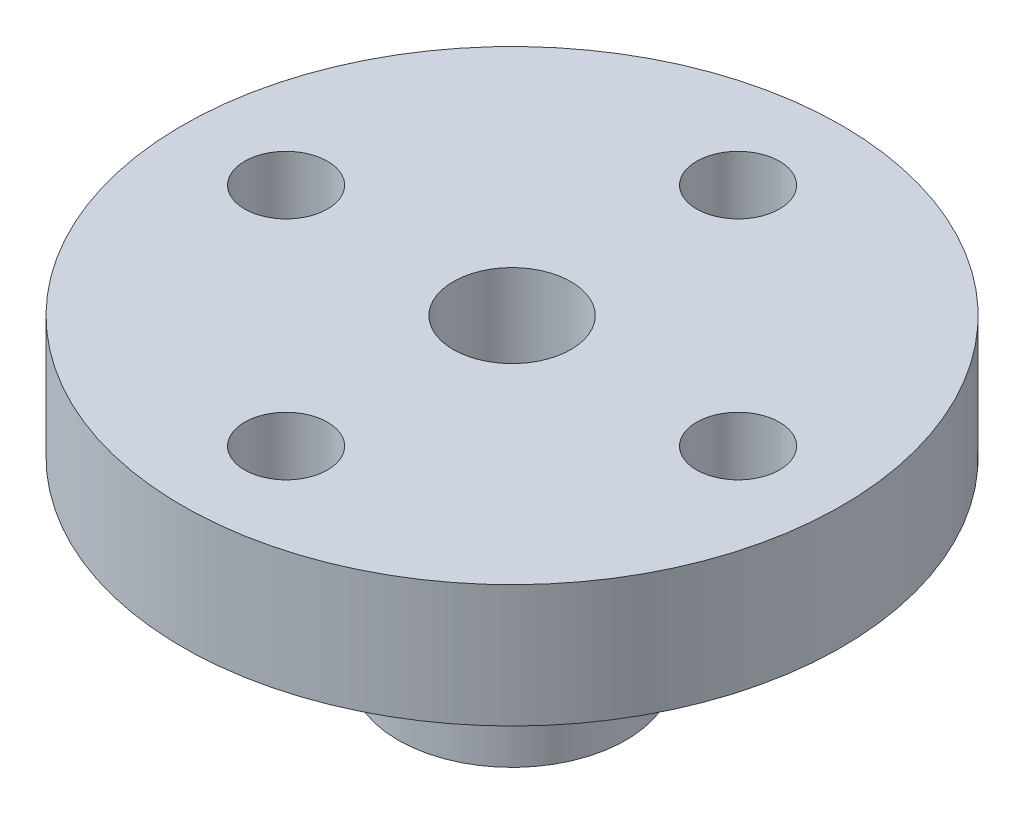
ISO-10303-21;
HEADER;
FILE_DESCRIPTION(('STEP AP214'),'2;1');
FILE_NAME('part.step','',(''),(''),'','','');
FILE_SCHEMA(('AUTOMOTIVE_DESIGN { 1 0 10303 214 1 1 1 1 }'));
ENDSEC;
DATA;
#1=APPLICATION_CONTEXT('core data for automotive mechanical design processes');
#2=APPLICATION_PROTOCOL_DEFINITION('international standard','automotive_design',2000,#1);
#3=PRODUCT_CONTEXT('',#1,'mechanical');
#4=PRODUCT('Part','Part','',(#3));
#5=PRODUCT_RELATED_PRODUCT_CATEGORY('part','',(#4));
#6=PRODUCT_DEFINITION_FORMATION('','',#4);
#7=PRODUCT_DEFINITION_CONTEXT('part definition',#1,'design');
#8=PRODUCT_DEFINITION('design','',#6,#7);
#9=PRODUCT_DEFINITION_SHAPE('','',#8);
#10=(LENGTH_UNIT() NAMED_UNIT(*) SI_UNIT(.MILLI.,.METRE.));
#11=(NAMED_UNIT(*) PLANE_ANGLE_UNIT() SI_UNIT($,.RADIAN.));
#12=(NAMED_UNIT(*) SI_UNIT($,.STERADIAN.) SOLID_ANGLE_UNIT());
#13=UNCERTAINTY_MEASURE_WITH_UNIT(LENGTH_MEASURE(1.E-05),#10,'distance_accuracy_value','');
#14=(GEOMETRIC_REPRESENTATION_CONTEXT(3) GLOBAL_UNCERTAINTY_ASSIGNED_CONTEXT((#13)) GLOBAL_UNIT_ASSIGNED_CONTEXT((#10,
#11,#12)) REPRESENTATION_CONTEXT('',''));
#15=CARTESIAN_POINT('',(0.,0.,0.));
#16=DIRECTION('',(0.,0.,1.));
#17=DIRECTION('',(1.,0.,0.));
#18=AXIS2_PLACEMENT_3D('',#15,#16,#17);
#19=CARTESIAN_POINT('',(-17.5,4.91640441757126,0.));
#20=DIRECTION('',(1.,0.,0.));
#21=DIRECTION('',(0.,0.,-1.));
#22=AXIS2_PLACEMENT_3D('',#19,#20,#21);
#23=CYLINDRICAL_SURFACE('',#22,1.5);
#24=CARTESIAN_POINT('',(5.86110057924278,4.91640441757126,-1.5));
#25=CARTESIAN_POINT('',(5.86110217367536,4.83355028894298,-1.49999760729791));
#26=CARTESIAN_POINT('',(5.86287663428657,4.75066953371097,-1.49311181217705));
#27=CARTESIAN_POINT('',(5.86976498249834,4.58728647023226,-1.46579350632765));
#28=CARTESIAN_POINT('',(5.87488084608938,4.50678559882918,-1.445352979689));
#29=CARTESIAN_POINT('',(5.88783778656131,4.35054918411982,-1.39162611516137));
#30=CARTESIAN_POINT('',(5.8956753813872,4.27480769739723,-1.35835618463151));
#31=CARTESIAN_POINT('',(5.91318836160376,4.12997351188982,-1.27996470184059));
#32=CARTESIAN_POINT('',(5.92286381710868,4.06088106691707,-1.23484269739853));
#33=CARTESIAN_POINT('',(5.94319677296986,3.92981057700297,-1.13298474675015));
#34=CARTESIAN_POINT('',(5.95386975225715,3.86799766748243,-1.07603935351548));
#35=CARTESIAN_POINT('',(5.97486081852894,3.75469510054761,-0.952602302875023));
#36=CARTESIAN_POINT('',(5.98517887267731,3.70320639616749,-0.886109765137408));
#37=CARTESIAN_POINT('',(6.00446859697605,3.61133974619235,-0.744336271648473));
#38=CARTESIAN_POINT('',(6.01341987085189,3.57112379118912,-0.668947333761871));
#39=CARTESIAN_POINT('',(6.02879099894912,3.50399713027387,-0.512220466156249));
#40=CARTESIAN_POINT('',(6.03521122030227,3.47708449455792,-0.430883401249684));
#41=CARTESIAN_POINT('',(6.04468743585777,3.43785669425962,-0.266290396119425));
#42=CARTESIAN_POINT('',(6.04780795818022,3.42526116478367,-0.183105055079771));
#43=CARTESIAN_POINT('',(6.0505579516296,3.41414531066911,-0.0157474370432209));
#44=CARTESIAN_POINT('',(6.05018793073681,3.41562293795818,0.0684246945649368));
#45=CARTESIAN_POINT('',(6.04604665321057,3.4324093072744,0.233422888586486));
#46=CARTESIAN_POINT('',(6.04234981165999,3.44741545348729,0.314281884537096));
#47=CARTESIAN_POINT('',(6.0320567873074,3.49034679893458,0.472296327731109));
#48=CARTESIAN_POINT('',(6.02546045160435,3.51827267947845,0.549451579424342));
#49=CARTESIAN_POINT('',(6.00999536208592,3.58649718092285,0.698668567709345));
#50=CARTESIAN_POINT('',(6.00110685770729,3.62690397468705,0.770678714844494));
#51=CARTESIAN_POINT('',(5.98202234290113,3.71886134742824,0.907002591352019));
#52=CARTESIAN_POINT('',(5.97182610847385,3.77041383657987,0.971314998529293));
#53=CARTESIAN_POINT('',(5.95091759023657,3.88482315694281,1.09222215921076));
#54=CARTESIAN_POINT('',(5.94019879471365,3.94794444879815,1.14856580377562));
#55=CARTESIAN_POINT('',(5.91970208093319,4.08285196204424,1.24992355886011));
#56=CARTESIAN_POINT('',(5.90992420519092,4.15463857464559,1.29493715758235));
#57=CARTESIAN_POINT('',(5.89239348689465,4.30532542637892,1.37251428556563));
#58=CARTESIAN_POINT('',(5.88465038180007,4.3842575253778,1.4050182819803));
#59=CARTESIAN_POINT('',(5.87219140120225,4.54670393128771,1.45621769350445));
#60=CARTESIAN_POINT('',(5.86747488999598,4.63021727195617,1.47491600847108));
#61=CARTESIAN_POINT('',(5.86173629027501,4.79712916271117,1.49755857016642));
#62=CARTESIAN_POINT('',(5.86062135564323,4.88047426747367,1.50187370065171));
#63=CARTESIAN_POINT('',(5.86195957531532,5.04669372785392,1.49664199033746));
#64=CARTESIAN_POINT('',(5.86441240716819,5.12956812533413,1.48709640225529));
#65=CARTESIAN_POINT('',(5.87252090694453,5.29112254782296,1.45473918826511));
#66=CARTESIAN_POINT('',(5.87812460220794,5.36984851357167,1.43214267357483));
#67=CARTESIAN_POINT('',(5.89185426126893,5.52239528418256,1.37456314650524));
#68=CARTESIAN_POINT('',(5.89998052003537,5.59621551418013,1.33957868550896));
#69=CARTESIAN_POINT('',(5.9180357563623,5.73842913074037,1.25743723368045));
#70=CARTESIAN_POINT('',(5.92799654258515,5.80669004205097,1.21005803083144));
#71=CARTESIAN_POINT('',(5.94852006867982,5.93442873090429,1.10475366386702));
#72=CARTESIAN_POINT('',(5.95908290558408,5.99390508706203,1.04682679646502));
#73=CARTESIAN_POINT('',(5.97993443343643,6.10388433172614,0.920370957671624));
#74=CARTESIAN_POINT('',(5.99021001670874,6.15413090787887,0.851616508272099));
#75=CARTESIAN_POINT('',(6.00906038437325,6.24236475603797,0.70643029594458));
#76=CARTESIAN_POINT('',(6.01763525706996,6.28035266460464,0.629998931928884));
#77=CARTESIAN_POINT('',(6.03206425372718,6.34266374028765,0.472154470432042));
#78=CARTESIAN_POINT('',(6.03793777127095,6.36708458044611,0.390781786962659));
#79=CARTESIAN_POINT('',(6.04638710617045,6.40186249072682,0.224922898812479));
#80=CARTESIAN_POINT('',(6.04896354877285,6.412222227374,0.140437287584548));
#81=CARTESIAN_POINT('',(6.05050340142597,6.41843593197918,-0.0268395993869966));
#82=CARTESIAN_POINT('',(6.0495611020357,6.41466845087301,-0.109616160271726));
#83=CARTESIAN_POINT('',(6.04437794752261,6.39360030405623,-0.273317601317941));
#84=CARTESIAN_POINT('',(6.04013718756209,6.37630002877372,-0.354242534830508));
#85=CARTESIAN_POINT('',(6.02884767516888,6.32885900732772,-0.511554490385021));
#86=CARTESIAN_POINT('',(6.02181368205091,6.29878569609766,-0.587962977172824));
#87=CARTESIAN_POINT('',(6.00567908247639,6.22671365192592,-0.734692610041686));
#88=CARTESIAN_POINT('',(5.99657821932499,6.18471343756062,-0.805012998512027));
#89=CARTESIAN_POINT('',(5.97702334081307,6.08881973126897,-0.939368966220431));
#90=CARTESIAN_POINT('',(5.96654243871359,6.03466872330059,-1.00321683816191));
#91=CARTESIAN_POINT('',(5.94553123285239,5.91651192843006,-1.1210479399132));
#92=CARTESIAN_POINT('',(5.9350009172867,5.85250365703493,-1.17502867521914));
#93=CARTESIAN_POINT('',(5.91486446643399,5.71504172443013,-1.27256022779907));
#94=CARTESIAN_POINT('',(5.90527872854423,5.64143687405652,-1.31590249407604));
#95=CARTESIAN_POINT('',(5.8883898493467,5.48775867589844,-1.38953305297952));
#96=CARTESIAN_POINT('',(5.88108502882819,5.40769014159192,-1.41983095511834));
#97=CARTESIAN_POINT('',(5.87074164327452,5.25918860762165,-1.46193818009331));
#98=CARTESIAN_POINT('',(5.8671532176125,5.19147355194249,-1.47618052311146));
#99=CARTESIAN_POINT('',(5.86233211731693,5.05464657191022,-1.49521204246427));
#100=CARTESIAN_POINT('',(5.86109924890864,4.98553476293064,-1.50000199637996));
#101=CARTESIAN_POINT('',(5.86110057924278,4.91640441757126,-1.5));
#102=B_SPLINE_CURVE_WITH_KNOTS('',3,(#24,#25,#26,#27,#28,#29,#30,#31,#32,#33,#34,#35,#36,#37,
#38,#39,#40,#41,#42,#43,#44,#45,#46,#47,#48,#49,#50,#51,#52,#53,#54,#55,#56,#57,#58,#59,#60,#61,
#62,#63,#64,#65,#66,#67,#68,#69,#70,#71,#72,#73,#74,#75,#76,#77,#78,#79,#80,#81,#82,#83,#84,#85,
#86,#87,#88,#89,#90,#91,#92,#93,#94,#95,#96,#97,#98,#99,#100,#101),.UNSPECIFIED.,.T.,.F.,(4,2,2,
2,2,2,2,2,2,2,2,2,2,2,2,2,2,2,2,2,2,2,2,2,2,2,2,2,2,2,2,2,2,2,2,2,2,2,4),(0.,0.248308555378158,
0.496764084985493,0.744902916216996,0.993051215830474,1.24604175182046,1.49905563079248,
1.7555380079994,2.01198316847504,2.2633149664209,2.51461018850564,2.76042038788378,
3.0062435512986,3.25426007800209,3.5023191440844,3.75698358308596,4.01165952364873,
4.26753289950162,4.52335251433645,4.77252234046925,5.02166964829331,5.26682305522691,
5.51200513928917,5.76192634197362,6.01188793896216,6.26798960627748,6.52407797276705,
6.77829797232379,7.0324697552718,7.27988006564556,7.5272832383672,7.77339617740615,
8.01953969916323,8.27149784954299,8.52351960945305,8.78014536003377,9.03658173491865,
9.24377802972128,9.45095727924298),.UNSPECIFIED.);
#103=CARTESIAN_POINT('',(5.86110057924278,4.91640441757126,-1.5));
#104=VERTEX_POINT('',#103);
#105=EDGE_CURVE('E100',#104,#104,#102,.T.);
#106=ORIENTED_EDGE('',*,*,#105,.F.);
#107=EDGE_LOOP('',(#106));
#108=FACE_BOUND('',#107,.T.);
#109=CARTESIAN_POINT('',(2.74146402493266,4.91640441757126,-1.5));
#110=CARTESIAN_POINT('',(2.74146996121996,4.83776755027954,-1.49999502319464));
#111=CARTESIAN_POINT('',(2.74489809372052,4.75902068295357,-1.49377563016989));
#112=CARTESIAN_POINT('',(2.75812736527123,4.60390586523926,-1.46919766449923));
#113=CARTESIAN_POINT('',(2.76794294853597,4.52754371868152,-1.45081157719412));
#114=CARTESIAN_POINT('',(2.79255297288178,4.37973016490376,-1.40285014033336));
#115=CARTESIAN_POINT('',(2.80732252306476,4.30825631645778,-1.37333063943399));
#116=CARTESIAN_POINT('',(2.84013813986528,4.17129277894347,-1.30410994384007));
#117=CARTESIAN_POINT('',(2.85818415477576,4.10580299546299,-1.26440890981985));
#118=CARTESIAN_POINT('',(2.89719238559248,3.97718309984594,-1.17242376157262));
#119=CARTESIAN_POINT('',(2.9182719439196,3.91460680431444,-1.11941466759992));
#120=CARTESIAN_POINT('',(2.96002150691264,3.79880733029977,-1.00382957324935));
#121=CARTESIAN_POINT('',(2.98069131648294,3.7455885166348,-0.941249133610087));
#122=CARTESIAN_POINT('',(3.02080070647273,3.64684864178488,-0.80363208620947));
#123=CARTESIAN_POINT('',(3.04008858949016,3.60199419124542,-0.728068847175413));
#124=CARTESIAN_POINT('',(3.07376045297882,3.52588394086473,-0.56937090331768));
#125=CARTESIAN_POINT('',(3.088147289895,3.49462021708453,-0.48624064465829));
#126=CARTESIAN_POINT('',(3.10955417092682,3.44872405755737,-0.320623319582033));
#127=CARTESIAN_POINT('',(3.11700017182242,3.43312461249767,-0.23846050683322));
#128=CARTESIAN_POINT('',(3.12526573473764,3.41583039859793,-0.0723712276097558));
#129=CARTESIAN_POINT('',(3.12608895153193,3.41412796070522,0.0115542405030571));
#130=CARTESIAN_POINT('',(3.12123086680007,3.42426841085229,0.171578517668652));
#131=CARTESIAN_POINT('',(3.11606654640636,3.4350346356635,0.247764669325171));
#132=CARTESIAN_POINT('',(3.10057705294366,3.4679008846602,0.397093733251049));
#133=CARTESIAN_POINT('',(3.09025149573237,3.49000175246757,0.470236418561248));
#134=CARTESIAN_POINT('',(3.06520917254856,3.54509442605534,0.612724899610437));
#135=CARTESIAN_POINT('',(3.0504306169069,3.57824022542377,0.681999845091676));
#136=CARTESIAN_POINT('',(3.0178432047417,3.65429032204593,0.814179566198107));
#137=CARTESIAN_POINT('',(3.00003324293992,3.69719818056307,0.877082004957478));
#138=CARTESIAN_POINT('',(2.96121661286997,3.79594939576044,1.00069074042071));
#139=CARTESIAN_POINT('',(2.94006651392675,3.85260349321678,1.06070495929193));
#140=CARTESIAN_POINT('',(2.89801251465286,3.97504531456673,1.17073701211828));
#141=CARTESIAN_POINT('',(2.87710878676893,4.04083906651274,1.22074819502473));
#142=CARTESIAN_POINT('',(2.83669604375818,4.1841518975821,1.31202535980691));
#143=CARTESIAN_POINT('',(2.81732692582911,4.26211678796722,1.35265924835641));
#144=CARTESIAN_POINT('',(2.78403494764337,4.42493688352242,1.41992891752282));
#145=CARTESIAN_POINT('',(2.77010680287973,4.50978530587096,1.44657828918571));
#146=CARTESIAN_POINT('',(2.75073610617928,4.67707335901286,1.48306254043191));
#147=CARTESIAN_POINT('',(2.74472399154288,4.75919749396645,1.4940316301328));
#148=CARTESIAN_POINT('',(2.74023629895974,4.92431496606583,1.50225116756699));
#149=CARTESIAN_POINT('',(2.7417562797343,5.0073077622036,1.49950969968289));
#150=CARTESIAN_POINT('',(2.75155995309195,5.16325937276199,1.48142652440727));
#151=CARTESIAN_POINT('',(2.75917407384945,5.23641129904173,1.46733132828408));
#152=CARTESIAN_POINT('',(2.77935201956567,5.37919462759853,1.42873992691584));
#153=CARTESIAN_POINT('',(2.79191730293307,5.44882498574148,1.40424065689343));
#154=CARTESIAN_POINT('',(2.82127334271854,5.58623977416277,1.34432124261396));
#155=CARTESIAN_POINT('',(2.83823296977134,5.65378901859837,1.30844750792565));
#156=CARTESIAN_POINT('',(2.87429430873271,5.78228770265738,1.22720469439135));
#157=CARTESIAN_POINT('',(2.89339709874772,5.84323379002283,1.18183082652401));
#158=CARTESIAN_POINT('',(2.93421912584433,5.96407481215988,1.07680260933894));
#159=CARTESIAN_POINT('',(2.95598789518972,6.02305371799292,1.01610887806455));
#160=CARTESIAN_POINT('',(2.99776542890577,6.13024615209044,0.885290963323127));
#161=CARTESIAN_POINT('',(3.01777373953262,6.17845690985041,0.815164360319643));
#162=CARTESIAN_POINT('',(3.05428949919904,6.2634614642138,0.665561742960673));
#163=CARTESIAN_POINT('',(3.07072331783439,6.30002127328115,0.58593357649699));
#164=CARTESIAN_POINT('',(3.09768827669086,6.3588805516127,0.420644009934271));
#165=CARTESIAN_POINT('',(3.10822418908724,6.38119155208635,0.334987550873565));
#166=CARTESIAN_POINT('',(3.1214987782457,6.40914160177562,0.168111089615573));
#167=CARTESIAN_POINT('',(3.12483547685381,6.4160609706701,0.0871524125473156));
#168=CARTESIAN_POINT('',(3.12515235678516,6.41672251759999,-0.0748201851066078));
#169=CARTESIAN_POINT('',(3.1221344259988,6.41046860927078,-0.155834082138801));
#170=CARTESIAN_POINT('',(3.11042844173104,6.38584168354399,-0.310727656803573));
#171=CARTESIAN_POINT('',(3.10207685970693,6.36818717628066,-0.384749532050488));
#172=CARTESIAN_POINT('',(3.08081398164398,6.32217990945406,-0.528684015306518));
#173=CARTESIAN_POINT('',(3.06790198008443,6.29382549451275,-0.598595985538709));
#174=CARTESIAN_POINT('',(3.0379866469688,6.22587329517423,-0.735807899868394));
#175=CARTESIAN_POINT('',(3.02082652019988,6.18583044038229,-0.802852263649708));
#176=CARTESIAN_POINT('',(2.98427549357153,6.09621300863191,-0.929559295899317));
#177=CARTESIAN_POINT('',(2.96488357339337,6.04663406500983,-0.989218562013585));
#178=CARTESIAN_POINT('',(2.92372674888994,5.93402322354376,-1.10524983178194));
#179=CARTESIAN_POINT('',(2.90190804129545,5.8701719320995,-1.16080995591124));
#180=CARTESIAN_POINT('',(2.85993876294138,5.73361928125506,-1.26068161262124));
#181=CARTESIAN_POINT('',(2.83978948809644,5.66091115280766,-1.30498446074904));
#182=CARTESIAN_POINT('',(2.80326264631931,5.5066408707084,-1.38173539684566));
#183=CARTESIAN_POINT('',(2.78696935230803,5.42492971079383,-1.41392634983456));
#184=CARTESIAN_POINT('',(2.76120912361099,5.25628048130745,-1.46360999933793));
#185=CARTESIAN_POINT('',(2.75171929556735,5.16936101770235,-1.48115202200545));
#186=CARTESIAN_POINT('',(2.74478129510561,5.05409804862616,-1.49392286357302));
#187=CARTESIAN_POINT('',(2.74354093918849,5.02662833132422,-1.49619881749537));
#188=CARTESIAN_POINT('',(2.7418812392859,4.97157840081845,-1.49923830179791));
#189=CARTESIAN_POINT('',(2.74146194188287,4.94399818143428,-1.50000174636651));
#190=CARTESIAN_POINT('',(2.74146402493266,4.91640441757126,-1.5));
#191=B_SPLINE_CURVE_WITH_KNOTS('',3,(#109,#110,#111,#112,#113,#114,#115,#116,#117,#118,#119,
#120,#121,#122,#123,#124,#125,#126,#127,#128,#129,#130,#131,#132,#133,#134,#135,#136,#137,#138,
#139,#140,#141,#142,#143,#144,#145,#146,#147,#148,#149,#150,#151,#152,#153,#154,#155,#156,#157,
#158,#159,#160,#161,#162,#163,#164,#165,#166,#167,#168,#169,#170,#171,#172,#173,#174,#175,#176,
#177,#178,#179,#180,#181,#182,#183,#184,#185,#186,#187,#188,#189,#190),.UNSPECIFIED.,.T.,.F.,(4,
2,2,2,2,2,2,2,2,2,2,2,2,2,2,2,2,2,2,2,2,2,2,2,2,2,2,2,2,2,2,2,2,2,2,2,2,2,2,2,4),(0.,
0.235794616826038,0.472124307716339,0.707283931725783,0.942439844919949,1.19539516281559,
1.44846816106053,1.71696113992094,1.98529736595843,2.23580461984074,2.48617362213621,
2.71643891736501,2.94672135341036,3.18035910123549,3.41408221870578,3.66857824850543,
3.92324293504385,4.19191102309641,4.46031751650278,4.70810951525837,4.95575542155642,
5.17940808410081,5.40312667481972,5.63721566309122,5.87142294107026,6.13239468092304,
6.39343348826398,6.65942535690489,6.92520169119644,7.16788183168915,7.41048988475757,
7.63912937347616,7.86780424942178,8.10667848629961,8.345662367444,8.60670798026868,
8.86795437010317,9.13447011472124,9.4000847819772,9.48282068043097,9.56556127273779),.UNSPECIFIED.);
#192=CARTESIAN_POINT('',(2.74146402493266,4.91640441757126,-1.5));
#193=VERTEX_POINT('',#192);
#194=EDGE_CURVE('E159',#193,#193,#191,.T.);
#195=ORIENTED_EDGE('',*,*,#194,.T.);
#196=EDGE_LOOP('',(#195));
#197=FACE_BOUND('',#196,.T.);
#198=ADVANCED_FACE('F37',(#108,#197),#23,.F.);
#199=CARTESIAN_POINT('',(-5.86110057924278,4.91640441757126,-1.5));
#200=CARTESIAN_POINT('',(-5.86110217367536,4.99925854619954,-1.49999760729791));
#201=CARTESIAN_POINT('',(-5.86287663428657,5.08213930143155,-1.49311181217705));
#202=CARTESIAN_POINT('',(-5.86976498249834,5.24552236491026,-1.46579350632765));
#203=CARTESIAN_POINT('',(-5.87488084608938,5.32602323631334,-1.445352979689));
#204=CARTESIAN_POINT('',(-5.88783778656131,5.4822596510227,-1.39162611516137));
#205=CARTESIAN_POINT('',(-5.8956753813872,5.55800113774529,-1.35835618463151));
#206=CARTESIAN_POINT('',(-5.91318836160376,5.7028353232527,-1.27996470184059));
#207=CARTESIAN_POINT('',(-5.92286381710868,5.77192776822545,-1.23484269739853));
#208=CARTESIAN_POINT('',(-5.94319677296986,5.90299825813955,-1.13298474675015));
#209=CARTESIAN_POINT('',(-5.95386975225715,5.96481116766009,-1.07603935351548));
#210=CARTESIAN_POINT('',(-5.97486081852894,6.07811373459491,-0.952602302875023));
#211=CARTESIAN_POINT('',(-5.98517887267731,6.12960243897503,-0.886109765137408));
#212=CARTESIAN_POINT('',(-6.00446859697606,6.22146908895017,-0.744336271648473));
#213=CARTESIAN_POINT('',(-6.01341987085189,6.2616850439534,-0.668947333761871));
#214=CARTESIAN_POINT('',(-6.02879099894912,6.32881170486865,-0.512220466156249));
#215=CARTESIAN_POINT('',(-6.03521122030227,6.3557243405846,-0.430883401249684));
#216=CARTESIAN_POINT('',(-6.04468743585777,6.3949521408829,-0.266290396119424));
#217=CARTESIAN_POINT('',(-6.04780795818022,6.40754767035884,-0.183105055079771));
#218=CARTESIAN_POINT('',(-6.0505579516296,6.41866352447341,-0.0157474370432207));
#219=CARTESIAN_POINT('',(-6.05018793073681,6.41718589718434,0.068424694564937));
#220=CARTESIAN_POINT('',(-6.04604665321057,6.40039952786812,0.233422888586486));
#221=CARTESIAN_POINT('',(-6.04234981165999,6.38539338165523,0.314281884537096));
#222=CARTESIAN_POINT('',(-6.0320567873074,6.34246203620794,0.472296327731109));
#223=CARTESIAN_POINT('',(-6.02546045160435,6.31453615566407,0.549451579424342));
#224=CARTESIAN_POINT('',(-6.00999536208592,6.24631165421967,0.698668567709345));
#225=CARTESIAN_POINT('',(-6.00110685770729,6.20590486045547,0.770678714844493));
#226=CARTESIAN_POINT('',(-5.98202234290113,6.11394748771428,0.907002591352019));
#227=CARTESIAN_POINT('',(-5.97182610847385,6.06239499856265,0.971314998529293));
#228=CARTESIAN_POINT('',(-5.95091759023657,5.94798567819971,1.09222215921076));
#229=CARTESIAN_POINT('',(-5.94019879471365,5.88486438634437,1.14856580377562));
#230=CARTESIAN_POINT('',(-5.91970208093319,5.74995687309828,1.24992355886011));
#231=CARTESIAN_POINT('',(-5.90992420519092,5.67817026049693,1.29493715758235));
#232=CARTESIAN_POINT('',(-5.89239348689465,5.5274834087636,1.37251428556563));
#233=CARTESIAN_POINT('',(-5.88465038180007,5.44855130976472,1.4050182819803));
#234=CARTESIAN_POINT('',(-5.87219140120225,5.28610490385481,1.45621769350445));
#235=CARTESIAN_POINT('',(-5.86747488999598,5.20259156318634,1.47491600847108));
#236=CARTESIAN_POINT('',(-5.86173629027501,5.03567967243135,1.49755857016642));
#237=CARTESIAN_POINT('',(-5.86062135564323,4.95233456766885,1.50187370065171));
#238=CARTESIAN_POINT('',(-5.86195957531532,4.7861151072886,1.49664199033746));
#239=CARTESIAN_POINT('',(-5.86441240716819,4.70324070980839,1.48709640225529));
#240=CARTESIAN_POINT('',(-5.87252090694453,4.54168628731956,1.45473918826511));
#241=CARTESIAN_POINT('',(-5.87812460220794,4.46296032157085,1.43214267357483));
#242=CARTESIAN_POINT('',(-5.89185426126893,4.31041355095996,1.37456314650524));
#243=CARTESIAN_POINT('',(-5.89998052003537,4.23659332096239,1.33957868550896));
#244=CARTESIAN_POINT('',(-5.9180357563623,4.09437970440215,1.25743723368044));
#245=CARTESIAN_POINT('',(-5.92799654258515,4.02611879309155,1.21005803083144));
#246=CARTESIAN_POINT('',(-5.94852006867982,3.89838010423823,1.10475366386702));
#247=CARTESIAN_POINT('',(-5.95908290558408,3.83890374808049,1.04682679646502));
#248=CARTESIAN_POINT('',(-5.97993443343643,3.72892450341638,0.920370957671625));
#249=CARTESIAN_POINT('',(-5.99021001670874,3.67867792726365,0.851616508272099));
#250=CARTESIAN_POINT('',(-6.00906038437325,3.59044407910455,0.706430295944581));
#251=CARTESIAN_POINT('',(-6.01763525706996,3.55245617053787,0.629998931928884));
#252=CARTESIAN_POINT('',(-6.03206425372718,3.49014509485487,0.472154470432043));
#253=CARTESIAN_POINT('',(-6.03793777127095,3.46572425469641,0.390781786962659));
#254=CARTESIAN_POINT('',(-6.04638710617045,3.4309463444157,0.22492289881248));
#255=CARTESIAN_POINT('',(-6.04896354877285,3.42058660776852,0.140437287584549));
#256=CARTESIAN_POINT('',(-6.05050340142597,3.41437290316334,-0.0268395993869956));
#257=CARTESIAN_POINT('',(-6.0495611020357,3.41814038426951,-0.109616160271726));
#258=CARTESIAN_POINT('',(-6.04437794752261,3.43920853108629,-0.27331760131794));
#259=CARTESIAN_POINT('',(-6.04013718756209,3.4565088063688,-0.354242534830507));
#260=CARTESIAN_POINT('',(-6.02884767516888,3.50394982781479,-0.51155449038502));
#261=CARTESIAN_POINT('',(-6.02181368205091,3.53402313904486,-0.587962977172823));
#262=CARTESIAN_POINT('',(-6.00567908247639,3.6060951832166,-0.734692610041685));
#263=CARTESIAN_POINT('',(-5.99657821932499,3.6480953975819,-0.805012998512026));
#264=CARTESIAN_POINT('',(-5.97702334081307,3.74398910387355,-0.93936896622043));
#265=CARTESIAN_POINT('',(-5.96654243871359,3.79814011184193,-1.00321683816191));
#266=CARTESIAN_POINT('',(-5.94553123285239,3.91629690671246,-1.1210479399132));
#267=CARTESIAN_POINT('',(-5.9350009172867,3.98030517810759,-1.17502867521914));
#268=CARTESIAN_POINT('',(-5.91486446643399,4.11776711071239,-1.27256022779907));
#269=CARTESIAN_POINT('',(-5.90527872854423,4.191371961086,-1.31590249407604));
#270=CARTESIAN_POINT('',(-5.8883898493467,4.34505015924408,-1.38953305297952));
#271=CARTESIAN_POINT('',(-5.88108502882819,4.4251186935506,-1.41983095511834));
#272=CARTESIAN_POINT('',(-5.87074164327452,4.57362022752087,-1.46193818009331));
#273=CARTESIAN_POINT('',(-5.8671532176125,4.64133528320002,-1.47618052311146));
#274=CARTESIAN_POINT('',(-5.86233211731693,4.7781622632323,-1.49521204246427));
#275=CARTESIAN_POINT('',(-5.86109924890864,4.84727407221188,-1.50000199637996));
#276=CARTESIAN_POINT('',(-5.86110057924278,4.91640441757126,-1.5));
#277=B_SPLINE_CURVE_WITH_KNOTS('',3,(#199,#200,#201,#202,#203,#204,#205,#206,#207,#208,#209,
#210,#211,#212,#213,#214,#215,#216,#217,#218,#219,#220,#221,#222,#223,#224,#225,#226,#227,#228,
#229,#230,#231,#232,#233,#234,#235,#236,#237,#238,#239,#240,#241,#242,#243,#244,#245,#246,#247,
#248,#249,#250,#251,#252,#253,#254,#255,#256,#257,#258,#259,#260,#261,#262,#263,#264,#265,#266,
#267,#268,#269,#270,#271,#272,#273,#274,#275,#276),.UNSPECIFIED.,.T.,.F.,(4,2,2,2,2,2,2,2,2,2,2,
2,2,2,2,2,2,2,2,2,2,2,2,2,2,2,2,2,2,2,2,2,2,2,2,2,2,2,4),(0.,0.248308555378158,
0.496764084985493,0.744902916216996,0.993051215830474,1.24604175182046,1.49905563079248,
1.7555380079994,2.01198316847504,2.2633149664209,2.51461018850564,2.76042038788378,
3.0062435512986,3.25426007800209,3.5023191440844,3.75698358308596,4.01165952364873,
4.26753289950162,4.52335251433645,4.77252234046925,5.02166964829331,5.26682305522691,
5.51200513928917,5.76192634197362,6.01188793896216,6.26798960627748,6.52407797276705,
6.77829797232379,7.0324697552718,7.27988006564556,7.5272832383672,7.77339617740615,
8.01953969916323,8.27149784954299,8.52351960945305,8.78014536003377,9.03658173491864,
9.24377802972128,9.45095727924299),.UNSPECIFIED.);
#278=CARTESIAN_POINT('',(-5.86110057924278,4.91640441757126,-1.5));
#279=VERTEX_POINT('',#278);
#280=EDGE_CURVE('E66',#279,#279,#277,.T.);
#281=ORIENTED_EDGE('',*,*,#280,.F.);
#282=EDGE_LOOP('',(#281));
#283=FACE_BOUND('',#282,.T.);
#284=CARTESIAN_POINT('',(-2.74146402493266,4.91640441757126,-1.5));
#285=CARTESIAN_POINT('',(-2.74146996121996,4.99504128486298,-1.49999502319464));
#286=CARTESIAN_POINT('',(-2.74489809372052,5.07378815218895,-1.49377563016989));
#287=CARTESIAN_POINT('',(-2.75812736527123,5.22890296990326,-1.46919766449923));
#288=CARTESIAN_POINT('',(-2.76794294853597,5.305265116461,-1.45081157719412));
#289=CARTESIAN_POINT('',(-2.79255297288178,5.45307867023876,-1.40285014033336));
#290=CARTESIAN_POINT('',(-2.80732252306476,5.52455251868474,-1.37333063943399));
#291=CARTESIAN_POINT('',(-2.84013813986528,5.66151605619905,-1.30410994384007));
#292=CARTESIAN_POINT('',(-2.85818415477576,5.72700583967953,-1.26440890981985));
#293=CARTESIAN_POINT('',(-2.89719238559248,5.85562573529658,-1.17242376157262));
#294=CARTESIAN_POINT('',(-2.9182719439196,5.91820203082808,-1.11941466759993));
#295=CARTESIAN_POINT('',(-2.96002150691264,6.03400150484275,-1.00382957324935));
#296=CARTESIAN_POINT('',(-2.98069131648294,6.08722031850771,-0.941249133610087));
#297=CARTESIAN_POINT('',(-3.02080070647273,6.18596019335764,-0.80363208620947));
#298=CARTESIAN_POINT('',(-3.04008858949016,6.2308146438971,-0.728068847175414));
#299=CARTESIAN_POINT('',(-3.07376045297882,6.30692489427779,-0.56937090331768));
#300=CARTESIAN_POINT('',(-3.088147289895,6.33818861805799,-0.48624064465829));
#301=CARTESIAN_POINT('',(-3.10955417092682,6.38408477758515,-0.320623319582033));
#302=CARTESIAN_POINT('',(-3.11700017182242,6.39968422264485,-0.23846050683322));
#303=CARTESIAN_POINT('',(-3.12526573473764,6.41697843654459,-0.0723712276097558));
#304=CARTESIAN_POINT('',(-3.12608895153193,6.4186808744373,0.0115542405030571));
#305=CARTESIAN_POINT('',(-3.12123086680007,6.40854042429023,0.171578517668651));
#306=CARTESIAN_POINT('',(-3.11606654640636,6.39777419947902,0.24776466932517));
#307=CARTESIAN_POINT('',(-3.10057705294366,6.36490795048232,0.397093733251049));
#308=CARTESIAN_POINT('',(-3.09025149573237,6.34280708267495,0.470236418561248));
#309=CARTESIAN_POINT('',(-3.06520917254856,6.28771440908718,0.612724899610436));
#310=CARTESIAN_POINT('',(-3.0504306169069,6.25456860971875,0.681999845091675));
#311=CARTESIAN_POINT('',(-3.0178432047417,6.17851851309659,0.814179566198107));
#312=CARTESIAN_POINT('',(-3.00003324293992,6.13561065457945,0.877082004957477));
#313=CARTESIAN_POINT('',(-2.96121661286997,6.03685943938209,1.00069074042071));
#314=CARTESIAN_POINT('',(-2.94006651392675,5.98020534192574,1.06070495929193));
#315=CARTESIAN_POINT('',(-2.89801251465286,5.85776352057579,1.17073701211828));
#316=CARTESIAN_POINT('',(-2.87710878676893,5.79196976862978,1.22074819502473));
#317=CARTESIAN_POINT('',(-2.83669604375818,5.64865693756042,1.31202535980691));
#318=CARTESIAN_POINT('',(-2.81732692582911,5.5706920471753,1.35265924835641));
#319=CARTESIAN_POINT('',(-2.78403494764337,5.4078719516201,1.41992891752282));
#320=CARTESIAN_POINT('',(-2.77010680287973,5.32302352927156,1.44657828918571));
#321=CARTESIAN_POINT('',(-2.75073610617928,5.15573547612966,1.48306254043191));
#322=CARTESIAN_POINT('',(-2.74472399154288,5.07361134117607,1.4940316301328));
#323=CARTESIAN_POINT('',(-2.74023629895974,4.90849386907669,1.50225116756699));
#324=CARTESIAN_POINT('',(-2.7417562797343,4.82550107293892,1.49950969968289));
#325=CARTESIAN_POINT('',(-2.75155995309195,4.66954946238053,1.48142652440727));
#326=CARTESIAN_POINT('',(-2.75917407384945,4.59639753610079,1.46733132828408));
#327=CARTESIAN_POINT('',(-2.77935201956567,4.45361420754399,1.42873992691584));
#328=CARTESIAN_POINT('',(-2.79191730293307,4.38398384940104,1.40424065689343));
#329=CARTESIAN_POINT('',(-2.82127334271854,4.24656906097975,1.34432124261396));
#330=CARTESIAN_POINT('',(-2.83823296977134,4.17901981654415,1.30844750792565));
#331=CARTESIAN_POINT('',(-2.87429430873271,4.05052113248514,1.22720469439135));
#332=CARTESIAN_POINT('',(-2.89339709874772,3.98957504511969,1.18183082652401));
#333=CARTESIAN_POINT('',(-2.93421912584433,3.86873402298264,1.07680260933894));
#334=CARTESIAN_POINT('',(-2.95598789518972,3.80975511714959,1.01610887806455));
#335=CARTESIAN_POINT('',(-2.99776542890577,3.70256268305208,0.885290963323127));
#336=CARTESIAN_POINT('',(-3.01777373953262,3.65435192529211,0.815164360319643));
#337=CARTESIAN_POINT('',(-3.05428949919904,3.56934737092872,0.665561742960673));
#338=CARTESIAN_POINT('',(-3.07072331783438,3.53278756186137,0.585933576496991));
#339=CARTESIAN_POINT('',(-3.09768827669086,3.47392828352982,0.420644009934271));
#340=CARTESIAN_POINT('',(-3.10822418908724,3.45161728305617,0.334987550873565));
#341=CARTESIAN_POINT('',(-3.1214987782457,3.4236672333669,0.168111089615572));
#342=CARTESIAN_POINT('',(-3.12483547685381,3.41674786447242,0.0871524125473147));
#343=CARTESIAN_POINT('',(-3.12515235678516,3.41608631754253,-0.0748201851066085));
#344=CARTESIAN_POINT('',(-3.1221344259988,3.42234022587174,-0.155834082138802));
#345=CARTESIAN_POINT('',(-3.11042844173104,3.44696715159853,-0.310727656803573));
#346=CARTESIAN_POINT('',(-3.10207685970693,3.46462165886186,-0.384749532050489));
#347=CARTESIAN_POINT('',(-3.08081398164398,3.51062892568846,-0.528684015306519));
#348=CARTESIAN_POINT('',(-3.06790198008443,3.53898334062977,-0.59859598553871));
#349=CARTESIAN_POINT('',(-3.0379866469688,3.60693553996829,-0.735807899868394));
#350=CARTESIAN_POINT('',(-3.02082652019988,3.64697839476022,-0.802852263649707));
#351=CARTESIAN_POINT('',(-2.98427549357153,3.73659582651061,-0.929559295899316));
#352=CARTESIAN_POINT('',(-2.96488357339337,3.78617477013269,-0.989218562013585));
#353=CARTESIAN_POINT('',(-2.92372674888994,3.89878561159876,-1.10524983178194));
#354=CARTESIAN_POINT('',(-2.90190804129545,3.96263690304302,-1.16080995591124));
#355=CARTESIAN_POINT('',(-2.85993876294138,4.09918955388746,-1.26068161262124));
#356=CARTESIAN_POINT('',(-2.83978948809644,4.17189768233486,-1.30498446074904));
#357=CARTESIAN_POINT('',(-2.80326264631931,4.32616796443413,-1.38173539684566));
#358=CARTESIAN_POINT('',(-2.78696935230803,4.40787912434869,-1.41392634983456));
#359=CARTESIAN_POINT('',(-2.76120912361099,4.57652835383507,-1.46360999933793));
#360=CARTESIAN_POINT('',(-2.75171929556735,4.66344781744017,-1.48115202200545));
#361=CARTESIAN_POINT('',(-2.74478129510561,4.77871078651636,-1.49392286357302));
#362=CARTESIAN_POINT('',(-2.74354093918849,4.8061805038183,-1.49619881749537));
#363=CARTESIAN_POINT('',(-2.7418812392859,4.86123043432407,-1.49923830179791));
#364=CARTESIAN_POINT('',(-2.74146194188287,4.88881065370824,-1.50000174636651));
#365=CARTESIAN_POINT('',(-2.74146402493266,4.91640441757126,-1.5));
#366=B_SPLINE_CURVE_WITH_KNOTS('',3,(#284,#285,#286,#287,#288,#289,#290,#291,#292,#293,#294,
#295,#296,#297,#298,#299,#300,#301,#302,#303,#304,#305,#306,#307,#308,#309,#310,#311,#312,#313,
#314,#315,#316,#317,#318,#319,#320,#321,#322,#323,#324,#325,#326,#327,#328,#329,#330,#331,#332,
#333,#334,#335,#336,#337,#338,#339,#340,#341,#342,#343,#344,#345,#346,#347,#348,#349,#350,#351,
#352,#353,#354,#355,#356,#357,#358,#359,#360,#361,#362,#363,#364,#365),.UNSPECIFIED.,.T.,.F.,(4,
2,2,2,2,2,2,2,2,2,2,2,2,2,2,2,2,2,2,2,2,2,2,2,2,2,2,2,2,2,2,2,2,2,2,2,2,2,2,2,4),(0.,
0.235794616826038,0.472124307716339,0.707283931725783,0.942439844919949,1.19539516281559,
1.44846816106053,1.71696113992094,1.98529736595843,2.23580461984074,2.48617362213621,
2.71643891736501,2.94672135341036,3.18035910123549,3.41408221870578,3.66857824850543,
3.92324293504385,4.19191102309641,4.46031751650278,4.70810951525837,4.95575542155642,
5.17940808410081,5.40312667481972,5.63721566309122,5.87142294107026,6.13239468092304,
6.39343348826398,6.65942535690489,6.92520169119644,7.16788183168915,7.41048988475757,
7.63912937347616,7.86780424942178,8.1066784862996,8.345662367444,8.60670798026867,
8.86795437010317,9.13447011472124,9.4000847819772,9.48282068043096,9.56556127273778),.UNSPECIFIED.);
#367=CARTESIAN_POINT('',(-2.74146402493266,4.91640441757126,-1.5));
#368=VERTEX_POINT('',#367);
#369=EDGE_CURVE('E164',#368,#368,#366,.T.);
#370=ORIENTED_EDGE('',*,*,#369,.T.);
#371=EDGE_LOOP('',(#370));
#372=FACE_BOUND('',#371,.T.);
#373=ADVANCED_FACE('F109',(#283,#372),#23,.F.);
#374=CARTESIAN_POINT('',(0.,0.,0.));
#375=DIRECTION('',(0.,1.,0.));
#376=DIRECTION('',(0.,0.,1.));
#377=AXIS2_PLACEMENT_3D('',#374,#375,#376);
#378=PLANE('',#377);
#379=CARTESIAN_POINT('',(0.,0.,0.));
#380=DIRECTION('',(0.,1.,0.));
#381=DIRECTION('',(0.,0.,1.));
#382=AXIS2_PLACEMENT_3D('',#379,#380,#381);
#383=CIRCLE('',#382,3.125);
#384=CARTESIAN_POINT('',(0.,0.,3.125));
#385=VERTEX_POINT('',#384);
#386=EDGE_CURVE('E154',#385,#385,#383,.T.);
#387=ORIENTED_EDGE('',*,*,#386,.T.);
#388=EDGE_LOOP('',(#387));
#389=FACE_BOUND('',#388,.T.);
#390=CARTESIAN_POINT('',(0.,0.,0.));
#391=DIRECTION('',(0.,1.,0.));
#392=DIRECTION('',(0.,0.,1.));
#393=AXIS2_PLACEMENT_3D('',#390,#391,#392);
#394=CIRCLE('',#393,6.05);
#395=CARTESIAN_POINT('',(0.,0.,6.05));
#396=VERTEX_POINT('',#395);
#397=EDGE_CURVE('E42',#396,#396,#394,.T.);
#398=ORIENTED_EDGE('',*,*,#397,.F.);
#399=EDGE_LOOP('',(#398));
#400=FACE_BOUND('',#399,.T.);
#401=ADVANCED_FACE('F142',(#389,#400),#378,.F.);
#402=CARTESIAN_POINT('',(0.,10.,0.));
#403=DIRECTION('',(0.,-1.,0.));
#404=DIRECTION('',(0.,0.,-1.));
#405=AXIS2_PLACEMENT_3D('',#402,#403,#404);
#406=CYLINDRICAL_SURFACE('',#405,6.05);
#407=ORIENTED_EDGE('',*,*,#280,.T.);
#408=EDGE_LOOP('',(#407));
#409=FACE_BOUND('',#408,.T.);
#410=ORIENTED_EDGE('',*,*,#105,.T.);
#411=EDGE_LOOP('',(#410));
#412=FACE_BOUND('',#411,.T.);
#413=CARTESIAN_POINT('',(0.,10.,0.));
#414=DIRECTION('',(0.,1.,0.));
#415=DIRECTION('',(0.,0.,1.));
#416=AXIS2_PLACEMENT_3D('',#413,#414,#415);
#417=CIRCLE('',#416,6.05);
#418=CARTESIAN_POINT('',(0.,10.,6.05));
#419=VERTEX_POINT('',#418);
#420=EDGE_CURVE('E10',#419,#419,#417,.T.);
#421=ORIENTED_EDGE('',*,*,#420,.F.);
#422=EDGE_LOOP('',(#421));
#423=FACE_BOUND('',#422,.T.);
#424=ORIENTED_EDGE('',*,*,#397,.T.);
#425=EDGE_LOOP('',(#424));
#426=FACE_BOUND('',#425,.T.);
#427=ADVANCED_FACE('F39',(#409,#412,#423,#426),#406,.T.);
#428=CARTESIAN_POINT('',(0.,16.5,0.));
#429=DIRECTION('',(0.,-1.,0.));
#430=DIRECTION('',(0.,0.,-1.));
#431=AXIS2_PLACEMENT_3D('',#428,#429,#430);
#432=CYLINDRICAL_SURFACE('',#431,17.5);
#433=CARTESIAN_POINT('',(0.,16.5,0.));
#434=DIRECTION('',(0.,1.,0.));
#435=DIRECTION('',(0.,0.,1.));
#436=AXIS2_PLACEMENT_3D('',#433,#434,#435);
#437=CIRCLE('',#436,17.5);
#438=CARTESIAN_POINT('',(0.,16.5,-17.5));
#439=VERTEX_POINT('',#438);
#440=EDGE_CURVE('E51',#439,#439,#437,.T.);
#441=CARTESIAN_POINT('',(0.,10.,0.));
#442=DIRECTION('',(0.,1.,0.));
#443=DIRECTION('',(0.,0.,1.));
#444=AXIS2_PLACEMENT_3D('',#441,#442,#443);
#445=CIRCLE('',#444,17.5);
#446=CARTESIAN_POINT('',(0.,10.,-17.5));
#447=VERTEX_POINT('',#446);
#448=EDGE_CURVE('E53',#447,#447,#445,.T.);
#449=CARTESIAN_POINT('',(0.,16.5,-17.5));
#450=CARTESIAN_POINT('',(0.,16.4322916666667,-17.5));
#451=CARTESIAN_POINT('',(0.,16.3645833333333,-17.5));
#452=CARTESIAN_POINT('',(0.,16.2291666666667,-17.5));
#453=CARTESIAN_POINT('',(0.,16.1614583333333,-17.5));
#454=CARTESIAN_POINT('',(0.,16.0260416666667,-17.5));
#455=CARTESIAN_POINT('',(0.,15.9583333333333,-17.5));
#456=CARTESIAN_POINT('',(0.,15.8229166666667,-17.5));
#457=CARTESIAN_POINT('',(0.,15.7552083333333,-17.5));
#458=CARTESIAN_POINT('',(0.,15.6197916666667,-17.5));
#459=CARTESIAN_POINT('',(0.,15.5520833333333,-17.5));
#460=CARTESIAN_POINT('',(0.,15.4166666666667,-17.5));
#461=CARTESIAN_POINT('',(0.,15.3489583333333,-17.5));
#462=CARTESIAN_POINT('',(0.,15.2135416666667,-17.5));
#463=CARTESIAN_POINT('',(0.,15.1458333333333,-17.5));
#464=CARTESIAN_POINT('',(0.,15.0104166666667,-17.5));
#465=CARTESIAN_POINT('',(0.,14.9427083333333,-17.5));
#466=CARTESIAN_POINT('',(0.,14.8072916666667,-17.5));
#467=CARTESIAN_POINT('',(0.,14.7395833333333,-17.5));
#468=CARTESIAN_POINT('',(0.,14.6041666666667,-17.5));
#469=CARTESIAN_POINT('',(0.,14.5364583333333,-17.5));
#470=CARTESIAN_POINT('',(0.,14.4010416666667,-17.5));
#471=CARTESIAN_POINT('',(0.,14.3333333333333,-17.5));
#472=CARTESIAN_POINT('',(0.,14.1979166666667,-17.5));
#473=CARTESIAN_POINT('',(0.,14.1302083333333,-17.5));
#474=CARTESIAN_POINT('',(0.,13.9947916666667,-17.5));
#475=CARTESIAN_POINT('',(0.,13.9270833333333,-17.5));
#476=CARTESIAN_POINT('',(0.,13.7916666666667,-17.5));
#477=CARTESIAN_POINT('',(0.,13.7239583333333,-17.5));
#478=CARTESIAN_POINT('',(0.,13.5885416666667,-17.5));
#479=CARTESIAN_POINT('',(0.,13.5208333333333,-17.5));
#480=CARTESIAN_POINT('',(0.,13.3854166666667,-17.5));
#481=CARTESIAN_POINT('',(0.,13.3177083333333,-17.5));
#482=CARTESIAN_POINT('',(0.,13.1822916666667,-17.5));
#483=CARTESIAN_POINT('',(0.,13.1145833333333,-17.5));
#484=CARTESIAN_POINT('',(0.,12.9791666666667,-17.5));
#485=CARTESIAN_POINT('',(0.,12.9114583333333,-17.5));
#486=CARTESIAN_POINT('',(0.,12.7760416666667,-17.5));
#487=CARTESIAN_POINT('',(0.,12.7083333333333,-17.5));
#488=CARTESIAN_POINT('',(0.,12.5729166666667,-17.5));
#489=CARTESIAN_POINT('',(0.,12.5052083333333,-17.5));
#490=CARTESIAN_POINT('',(0.,12.3697916666667,-17.5));
#491=CARTESIAN_POINT('',(0.,12.3020833333333,-17.5));
#492=CARTESIAN_POINT('',(0.,12.1666666666667,-17.5));
#493=CARTESIAN_POINT('',(0.,12.0989583333333,-17.5));
#494=CARTESIAN_POINT('',(0.,11.9635416666667,-17.5));
#495=CARTESIAN_POINT('',(0.,11.8958333333333,-17.5));
#496=CARTESIAN_POINT('',(0.,11.7604166666667,-17.5));
#497=CARTESIAN_POINT('',(0.,11.6927083333333,-17.5));
#498=CARTESIAN_POINT('',(0.,11.5572916666667,-17.5));
#499=CARTESIAN_POINT('',(0.,11.4895833333333,-17.5));
#500=CARTESIAN_POINT('',(0.,11.3541666666667,-17.5));
#501=CARTESIAN_POINT('',(0.,11.2864583333333,-17.5));
#502=CARTESIAN_POINT('',(0.,11.1510416666667,-17.5));
#503=CARTESIAN_POINT('',(0.,11.0833333333333,-17.5));
#504=CARTESIAN_POINT('',(0.,10.9479166666667,-17.5));
#505=CARTESIAN_POINT('',(0.,10.8802083333333,-17.5));
#506=CARTESIAN_POINT('',(0.,10.7447916666667,-17.5));
#507=CARTESIAN_POINT('',(0.,10.6770833333333,-17.5));
#508=CARTESIAN_POINT('',(0.,10.5416666666667,-17.5));
#509=CARTESIAN_POINT('',(0.,10.4739583333333,-17.5));
#510=CARTESIAN_POINT('',(0.,10.3385416666667,-17.5));
#511=CARTESIAN_POINT('',(0.,10.2708333333333,-17.5));
#512=CARTESIAN_POINT('',(0.,10.1354166666667,-17.5));
#513=CARTESIAN_POINT('',(0.,10.0677083333333,-17.5));
#514=CARTESIAN_POINT('',(0.,10.,-17.5));
#515=B_SPLINE_CURVE_WITH_KNOTS('',3,(#449,#450,#451,#452,#453,#454,#455,#456,#457,#458,#459,
#460,#461,#462,#463,#464,#465,#466,#467,#468,#469,#470,#471,#472,#473,#474,#475,#476,#477,#478,
#479,#480,#481,#482,#483,#484,#485,#486,#487,#488,#489,#490,#491,#492,#493,#494,#495,#496,#497,
#498,#499,#500,#501,#502,#503,#504,#505,#506,#507,#508,#509,#510,#511,#512,#513,#514),
.UNSPECIFIED.,.F.,.F.,(4,2,2,2,2,2,2,2,2,2,2,2,2,2,2,2,2,2,2,2,2,2,2,2,2,2,2,2,2,2,2,2,4),(0.,
0.203125000000002,0.40625,0.609375000000002,0.812500000000001,1.015625,1.21875,1.421875,1.625,
1.828125,2.03125,2.234375,2.4375,2.640625,2.84375,3.046875,3.25,3.453125,3.65625,3.859375,
4.0625,4.265625,4.46875,4.671875,4.875,5.078125,5.28125,5.484375,5.6875,5.890625,6.09375,
6.296875,6.5),.UNSPECIFIED.);
#516=EDGE_CURVE('BSEAM135',#439,#447,#515,.T.);
#517=ORIENTED_EDGE('',*,*,#440,.F.);
#518=ORIENTED_EDGE('',*,*,#448,.T.);
#519=ORIENTED_EDGE('',*,*,#516,.T.);
#520=ORIENTED_EDGE('',*,*,#516,.F.);
#521=EDGE_LOOP('',(#517,#519,#518,#520));
#522=FACE_BOUND('',#521,.T.);
#523=ADVANCED_FACE('F135',(#522),#432,.T.);
#524=CARTESIAN_POINT('',(0.,16.5,0.));
#525=DIRECTION('',(0.,1.,0.));
#526=DIRECTION('',(0.,0.,1.));
#527=AXIS2_PLACEMENT_3D('',#524,#525,#526);
#528=PLANE('',#527);
#529=CARTESIAN_POINT('',(0.,16.5,0.));
#530=DIRECTION('',(0.,1.,0.));
#531=DIRECTION('',(0.,0.,1.));
#532=AXIS2_PLACEMENT_3D('',#529,#530,#531);
#533=CIRCLE('',#532,3.125);
#534=CARTESIAN_POINT('',(0.,16.5,3.125));
#535=VERTEX_POINT('',#534);
#536=EDGE_CURVE('E178',#535,#535,#533,.F.);
#537=ORIENTED_EDGE('',*,*,#536,.T.);
#538=EDGE_LOOP('',(#537));
#539=FACE_BOUND('',#538,.T.);
#540=CARTESIAN_POINT('',(12.,16.5,0.));
#541=DIRECTION('',(0.,1.,0.));
#542=DIRECTION('',(0.,0.,1.));
#543=AXIS2_PLACEMENT_3D('',#540,#541,#542);
#544=CIRCLE('',#543,2.2);
#545=CARTESIAN_POINT('',(12.,16.5,2.2));
#546=VERTEX_POINT('',#545);
#547=EDGE_CURVE('E86',#546,#546,#544,.F.);
#548=ORIENTED_EDGE('',*,*,#547,.T.);
#549=EDGE_LOOP('',(#548));
#550=FACE_BOUND('',#549,.T.);
#551=CARTESIAN_POINT('',(0.,16.5,-12.));
#552=DIRECTION('',(0.,1.,0.));
#553=DIRECTION('',(0.,0.,1.));
#554=AXIS2_PLACEMENT_3D('',#551,#552,#553);
#555=CIRCLE('',#554,2.2);
#556=CARTESIAN_POINT('',(0.,16.5,-9.8));
#557=VERTEX_POINT('',#556);
#558=EDGE_CURVE('E78',#557,#557,#555,.F.);
#559=ORIENTED_EDGE('',*,*,#558,.T.);
#560=EDGE_LOOP('',(#559));
#561=FACE_BOUND('',#560,.T.);
#562=CARTESIAN_POINT('',(-12.,16.5,0.));
#563=DIRECTION('',(0.,1.,0.));
#564=DIRECTION('',(0.,0.,1.));
#565=AXIS2_PLACEMENT_3D('',#562,#563,#564);
#566=CIRCLE('',#565,2.2);
#567=CARTESIAN_POINT('',(-12.,16.5,2.2));
#568=VERTEX_POINT('',#567);
#569=EDGE_CURVE('E70',#568,#568,#566,.F.);
#570=ORIENTED_EDGE('',*,*,#569,.T.);
#571=EDGE_LOOP('',(#570));
#572=FACE_BOUND('',#571,.T.);
#573=CARTESIAN_POINT('',(0.,16.5,12.));
#574=DIRECTION('',(0.,1.,0.));
#575=DIRECTION('',(0.,0.,1.));
#576=AXIS2_PLACEMENT_3D('',#573,#574,#575);
#577=CIRCLE('',#576,2.2);
#578=CARTESIAN_POINT('',(0.,16.5,14.2));
#579=VERTEX_POINT('',#578);
#580=EDGE_CURVE('E61',#579,#579,#577,.F.);
#581=ORIENTED_EDGE('',*,*,#580,.T.);
#582=EDGE_LOOP('',(#581));
#583=FACE_BOUND('',#582,.T.);
#584=ORIENTED_EDGE('',*,*,#440,.T.);
#585=EDGE_LOOP('',(#584));
#586=FACE_BOUND('',#585,.T.);
#587=ADVANCED_FACE('F132',(#539,#550,#561,#572,#583,#586),#528,.T.);
#588=CARTESIAN_POINT('',(0.,10.,0.));
#589=DIRECTION('',(0.,1.,0.));
#590=DIRECTION('',(0.,0.,1.));
#591=AXIS2_PLACEMENT_3D('',#588,#589,#590);
#592=PLANE('',#591);
#593=CARTESIAN_POINT('',(12.,10.,0.));
#594=DIRECTION('',(0.,-1.,0.));
#595=DIRECTION('',(0.,0.,-1.));
#596=AXIS2_PLACEMENT_3D('',#593,#594,#595);
#597=CIRCLE('',#596,2.2);
#598=CARTESIAN_POINT('',(12.,10.,-2.2));
#599=VERTEX_POINT('',#598);
#600=EDGE_CURVE('E57',#599,#599,#597,.T.);
#601=ORIENTED_EDGE('',*,*,#600,.F.);
#602=EDGE_LOOP('',(#601));
#603=FACE_BOUND('',#602,.T.);
#604=CARTESIAN_POINT('',(0.,10.,-12.));
#605=DIRECTION('',(0.,-1.,0.));
#606=DIRECTION('',(0.,0.,-1.));
#607=AXIS2_PLACEMENT_3D('',#604,#605,#606);
#608=CIRCLE('',#607,2.2);
#609=CARTESIAN_POINT('',(0.,10.,-14.2));
#610=VERTEX_POINT('',#609);
#611=EDGE_CURVE('E82',#610,#610,#608,.T.);
#612=ORIENTED_EDGE('',*,*,#611,.F.);
#613=EDGE_LOOP('',(#612));
#614=FACE_BOUND('',#613,.T.);
#615=CARTESIAN_POINT('',(-12.,10.,0.));
#616=DIRECTION('',(0.,-1.,0.));
#617=DIRECTION('',(0.,0.,-1.));
#618=AXIS2_PLACEMENT_3D('',#615,#616,#617);
#619=CIRCLE('',#618,2.2);
#620=CARTESIAN_POINT('',(-12.,10.,-2.2));
#621=VERTEX_POINT('',#620);
#622=EDGE_CURVE('E74',#621,#621,#619,.T.);
#623=ORIENTED_EDGE('',*,*,#622,.F.);
#624=EDGE_LOOP('',(#623));
#625=FACE_BOUND('',#624,.T.);
#626=CARTESIAN_POINT('',(0.,10.,12.));
#627=DIRECTION('',(0.,-1.,0.));
#628=DIRECTION('',(0.,0.,-1.));
#629=AXIS2_PLACEMENT_3D('',#626,#627,#628);
#630=CIRCLE('',#629,2.2);
#631=CARTESIAN_POINT('',(0.,10.,9.8));
#632=VERTEX_POINT('',#631);
#633=EDGE_CURVE('E65',#632,#632,#630,.T.);
#634=ORIENTED_EDGE('',*,*,#633,.F.);
#635=EDGE_LOOP('',(#634));
#636=FACE_BOUND('',#635,.T.);
#637=ORIENTED_EDGE('',*,*,#420,.T.);
#638=EDGE_LOOP('',(#637));
#639=FACE_BOUND('',#638,.T.);
#640=ORIENTED_EDGE('',*,*,#448,.F.);
#641=EDGE_LOOP('',(#640));
#642=FACE_BOUND('',#641,.T.);
#643=ADVANCED_FACE('F130',(#603,#614,#625,#636,#639,#642),#592,.F.);
#644=CARTESIAN_POINT('',(0.,16.501,12.));
#645=DIRECTION('',(0.,-1.,0.));
#646=DIRECTION('',(0.,0.,-1.));
#647=AXIS2_PLACEMENT_3D('',#644,#645,#646);
#648=CYLINDRICAL_SURFACE('',#647,2.2);
#649=ORIENTED_EDGE('',*,*,#580,.F.);
#650=EDGE_LOOP('',(#649));
#651=FACE_BOUND('',#650,.T.);
#652=ORIENTED_EDGE('',*,*,#633,.T.);
#653=EDGE_LOOP('',(#652));
#654=FACE_BOUND('',#653,.T.);
#655=ADVANCED_FACE('F126',(#651,#654),#648,.F.);
#656=CARTESIAN_POINT('',(-12.,16.501,0.));
#657=DIRECTION('',(0.,-1.,0.));
#658=DIRECTION('',(0.,0.,-1.));
#659=AXIS2_PLACEMENT_3D('',#656,#657,#658);
#660=CYLINDRICAL_SURFACE('',#659,2.2);
#661=ORIENTED_EDGE('',*,*,#569,.F.);
#662=EDGE_LOOP('',(#661));
#663=FACE_BOUND('',#662,.T.);
#664=ORIENTED_EDGE('',*,*,#622,.T.);
#665=EDGE_LOOP('',(#664));
#666=FACE_BOUND('',#665,.T.);
#667=ADVANCED_FACE('F122',(#663,#666),#660,.F.);
#668=CARTESIAN_POINT('',(0.,16.501,-12.));
#669=DIRECTION('',(0.,-1.,0.));
#670=DIRECTION('',(0.,0.,-1.));
#671=AXIS2_PLACEMENT_3D('',#668,#669,#670);
#672=CYLINDRICAL_SURFACE('',#671,2.2);
#673=ORIENTED_EDGE('',*,*,#558,.F.);
#674=EDGE_LOOP('',(#673));
#675=FACE_BOUND('',#674,.T.);
#676=ORIENTED_EDGE('',*,*,#611,.T.);
#677=EDGE_LOOP('',(#676));
#678=FACE_BOUND('',#677,.T.);
#679=ADVANCED_FACE('F118',(#675,#678),#672,.F.);
#680=CARTESIAN_POINT('',(12.,16.501,0.));
#681=DIRECTION('',(0.,-1.,0.));
#682=DIRECTION('',(0.,0.,-1.));
#683=AXIS2_PLACEMENT_3D('',#680,#681,#682);
#684=CYLINDRICAL_SURFACE('',#683,2.2);
#685=ORIENTED_EDGE('',*,*,#547,.F.);
#686=EDGE_LOOP('',(#685));
#687=FACE_BOUND('',#686,.T.);
#688=ORIENTED_EDGE('',*,*,#600,.T.);
#689=EDGE_LOOP('',(#688));
#690=FACE_BOUND('',#689,.T.);
#691=ADVANCED_FACE('F114',(#687,#690),#684,.F.);
#692=CARTESIAN_POINT('',(0.,-0.000999999999999265,0.));
#693=DIRECTION('',(0.,1.,0.));
#694=DIRECTION('',(0.,0.,1.));
#695=AXIS2_PLACEMENT_3D('',#692,#693,#694);
#696=CYLINDRICAL_SURFACE('',#695,3.125);
#697=ORIENTED_EDGE('',*,*,#194,.F.);
#698=EDGE_LOOP('',(#697));
#699=FACE_BOUND('',#698,.T.);
#700=ORIENTED_EDGE('',*,*,#369,.F.);
#701=EDGE_LOOP('',(#700));
#702=FACE_BOUND('',#701,.T.);
#703=ORIENTED_EDGE('',*,*,#386,.F.);
#704=EDGE_LOOP('',(#703));
#705=FACE_BOUND('',#704,.T.);
#706=ORIENTED_EDGE('',*,*,#536,.F.);
#707=EDGE_LOOP('',(#706));
#708=FACE_BOUND('',#707,.T.);
#709=ADVANCED_FACE('F111',(#699,#702,#705,#708),#696,.F.);
#710=CLOSED_SHELL('',(#198,#373,#401,#427,#523,#587,#643,#655,#667,#679,#691,#709));
#711=MANIFOLD_SOLID_BREP('B2',#710);
#712=ADVANCED_BREP_SHAPE_REPRESENTATION('',(#18,#711),#14);
#713=SHAPE_DEFINITION_REPRESENTATION(#9,#712);
ENDSEC;
END-ISO-10303-21;
